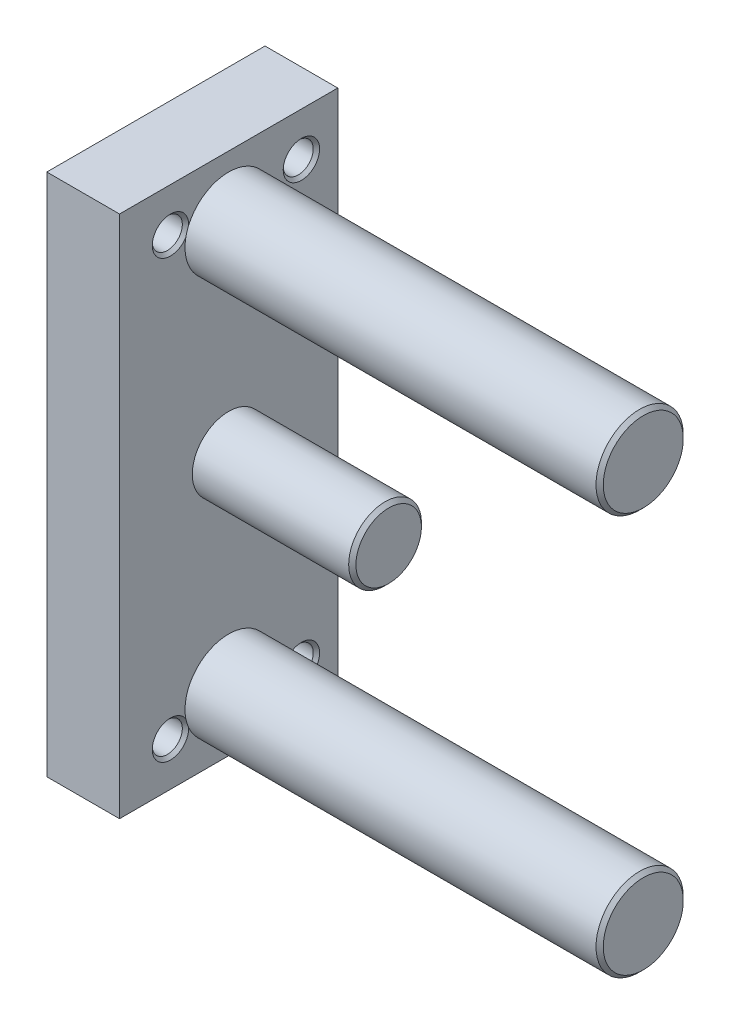
ISO-10303-21;
HEADER;
FILE_DESCRIPTION(('STEP AP214'),'2;1');
FILE_NAME('part.step','',(''),(''),'','','');
FILE_SCHEMA(('AUTOMOTIVE_DESIGN { 1 0 10303 214 1 1 1 1 }'));
ENDSEC;
DATA;
#1=APPLICATION_CONTEXT('core data for automotive mechanical design processes');
#2=APPLICATION_PROTOCOL_DEFINITION('international standard','automotive_design',2000,#1);
#3=PRODUCT_CONTEXT('',#1,'mechanical');
#4=PRODUCT('Part','Part','',(#3));
#5=PRODUCT_RELATED_PRODUCT_CATEGORY('part','',(#4));
#6=PRODUCT_DEFINITION_FORMATION('','',#4);
#7=PRODUCT_DEFINITION_CONTEXT('part definition',#1,'design');
#8=PRODUCT_DEFINITION('design','',#6,#7);
#9=PRODUCT_DEFINITION_SHAPE('','',#8);
#10=(LENGTH_UNIT() NAMED_UNIT(*) SI_UNIT(.MILLI.,.METRE.));
#11=(NAMED_UNIT(*) PLANE_ANGLE_UNIT() SI_UNIT($,.RADIAN.));
#12=(NAMED_UNIT(*) SI_UNIT($,.STERADIAN.) SOLID_ANGLE_UNIT());
#13=UNCERTAINTY_MEASURE_WITH_UNIT(LENGTH_MEASURE(1.E-05),#10,'distance_accuracy_value','');
#14=(GEOMETRIC_REPRESENTATION_CONTEXT(3) GLOBAL_UNCERTAINTY_ASSIGNED_CONTEXT((#13)) GLOBAL_UNIT_ASSIGNED_CONTEXT((#10,
#11,#12)) REPRESENTATION_CONTEXT('',''));
#15=CARTESIAN_POINT('',(0.,0.,0.));
#16=DIRECTION('',(0.,0.,1.));
#17=DIRECTION('',(1.,0.,0.));
#18=AXIS2_PLACEMENT_3D('',#15,#16,#17);
#19=CARTESIAN_POINT('',(10.,0.,0.));
#20=DIRECTION('',(1.,0.,0.));
#21=DIRECTION('',(0.,0.,-1.));
#22=AXIS2_PLACEMENT_3D('',#19,#20,#21);
#23=PLANE('',#22);
#24=CARTESIAN_POINT('',(10.,-30.,8.));
#25=DIRECTION('',(-1.,0.,0.));
#26=DIRECTION('',(0.,0.,1.));
#27=AXIS2_PLACEMENT_3D('',#24,#25,#26);
#28=CIRCLE('',#27,2.5);
#29=CARTESIAN_POINT('',(10.,-29.8926166328409,5.50230730223721));
#30=VERTEX_POINT('',#29);
#31=CARTESIAN_POINT('',(10.,-28.666102228369,5.88559305363468));
#32=VERTEX_POINT('',#31);
#33=EDGE_CURVE('E58',#30,#32,#28,.T.);
#34=ORIENTED_EDGE('',*,*,#33,.T.);
#35=CARTESIAN_POINT('',(10.,-27.5,0.));
#36=DIRECTION('',(-1.,0.,0.));
#37=DIRECTION('',(0.,0.,1.));
#38=AXIS2_PLACEMENT_3D('',#35,#36,#37);
#39=CIRCLE('',#38,6.);
#40=EDGE_CURVE('E124',#32,#30,#39,.T.);
#41=ORIENTED_EDGE('',*,*,#40,.T.);
#42=EDGE_LOOP('',(#34,#41));
#43=FACE_BOUND('',#42,.T.);
#44=CARTESIAN_POINT('',(10.,-30.,-9.99999999999999));
#45=DIRECTION('',(-1.,0.,0.));
#46=DIRECTION('',(0.,0.,1.));
#47=AXIS2_PLACEMENT_3D('',#44,#45,#46);
#48=CIRCLE('',#47,2.5);
#49=CARTESIAN_POINT('',(10.,-30.,-7.49999999999999));
#50=VERTEX_POINT('',#49);
#51=EDGE_CURVE('E219',#50,#50,#48,.T.);
#52=ORIENTED_EDGE('',*,*,#51,.T.);
#53=EDGE_LOOP('',(#52));
#54=FACE_BOUND('',#53,.T.);
#55=DIRECTION('',(0.,-1.,0.));
#56=VECTOR('',#55,1.);
#57=CARTESIAN_POINT('',(10.,36.,15.));
#58=LINE('',#57,#56);
#59=CARTESIAN_POINT('',(10.,36.,15.));
#60=VERTEX_POINT('',#59);
#61=CARTESIAN_POINT('',(10.,-36.,15.));
#62=VERTEX_POINT('',#61);
#63=EDGE_CURVE('E244',#60,#62,#58,.T.);
#64=ORIENTED_EDGE('',*,*,#63,.T.);
#65=DIRECTION('',(0.,0.,-1.));
#66=VECTOR('',#65,1.);
#67=CARTESIAN_POINT('',(10.,-36.,15.));
#68=LINE('',#67,#66);
#69=CARTESIAN_POINT('',(10.,-36.,-15.));
#70=VERTEX_POINT('',#69);
#71=EDGE_CURVE('E247',#62,#70,#68,.T.);
#72=ORIENTED_EDGE('',*,*,#71,.T.);
#73=DIRECTION('',(0.,1.,0.));
#74=VECTOR('',#73,1.);
#75=CARTESIAN_POINT('',(10.,-36.,-15.));
#76=LINE('',#75,#74);
#77=CARTESIAN_POINT('',(10.,36.,-15.));
#78=VERTEX_POINT('',#77);
#79=EDGE_CURVE('E250',#70,#78,#76,.T.);
#80=ORIENTED_EDGE('',*,*,#79,.T.);
#81=DIRECTION('',(0.,0.,1.));
#82=VECTOR('',#81,1.);
#83=CARTESIAN_POINT('',(10.,36.,-15.));
#84=LINE('',#83,#82);
#85=EDGE_CURVE('E252',#78,#60,#84,.T.);
#86=ORIENTED_EDGE('',*,*,#85,.T.);
#87=EDGE_LOOP('',(#64,#72,#80,#86));
#88=FACE_BOUND('',#87,.T.);
#89=CARTESIAN_POINT('',(10.,30.,-10.));
#90=DIRECTION('',(-1.,0.,0.));
#91=DIRECTION('',(0.,0.,1.));
#92=AXIS2_PLACEMENT_3D('',#89,#90,#91);
#93=CIRCLE('',#92,2.5);
#94=CARTESIAN_POINT('',(10.,30.,-7.5));
#95=VERTEX_POINT('',#94);
#96=EDGE_CURVE('E231',#95,#95,#93,.T.);
#97=ORIENTED_EDGE('',*,*,#96,.T.);
#98=EDGE_LOOP('',(#97));
#99=FACE_BOUND('',#98,.T.);
#100=CARTESIAN_POINT('',(10.,0.,0.));
#101=DIRECTION('',(-1.,0.,0.));
#102=DIRECTION('',(0.,0.,1.));
#103=AXIS2_PLACEMENT_3D('',#100,#101,#102);
#104=CIRCLE('',#103,5.);
#105=CARTESIAN_POINT('',(10.,0.,5.));
#106=VERTEX_POINT('',#105);
#107=EDGE_CURVE('E134',#106,#106,#104,.T.);
#108=ORIENTED_EDGE('',*,*,#107,.T.);
#109=EDGE_LOOP('',(#108));
#110=FACE_BOUND('',#109,.T.);
#111=CARTESIAN_POINT('',(10.,30.,7.99999999999999));
#112=DIRECTION('',(-1.,0.,0.));
#113=DIRECTION('',(0.,0.,1.));
#114=AXIS2_PLACEMENT_3D('',#111,#112,#113);
#115=CIRCLE('',#114,2.5);
#116=CARTESIAN_POINT('',(10.,28.6661022283692,5.88559305363465));
#117=VERTEX_POINT('',#116);
#118=CARTESIAN_POINT('',(10.,29.892616632841,5.5023073022372));
#119=VERTEX_POINT('',#118);
#120=EDGE_CURVE('E51',#117,#119,#115,.T.);
#121=ORIENTED_EDGE('',*,*,#120,.T.);
#122=CARTESIAN_POINT('',(10.,27.5,0.));
#123=DIRECTION('',(-1.,0.,0.));
#124=DIRECTION('',(0.,0.,1.));
#125=AXIS2_PLACEMENT_3D('',#122,#123,#124);
#126=CIRCLE('',#125,6.);
#127=EDGE_CURVE('E103',#119,#117,#126,.T.);
#128=ORIENTED_EDGE('',*,*,#127,.T.);
#129=EDGE_LOOP('',(#121,#128));
#130=FACE_BOUND('',#129,.T.);
#131=ADVANCED_FACE('F37',(#43,#54,#88,#99,#110,#130),#23,.T.);
#132=CARTESIAN_POINT('',(0.,0.,0.));
#133=DIRECTION('',(1.,0.,0.));
#134=DIRECTION('',(0.,0.,-1.));
#135=AXIS2_PLACEMENT_3D('',#132,#133,#134);
#136=PLANE('',#135);
#137=CARTESIAN_POINT('',(0.,0.,0.));
#138=DIRECTION('',(-1.,0.,0.));
#139=DIRECTION('',(0.,0.,1.));
#140=AXIS2_PLACEMENT_3D('',#137,#138,#139);
#141=CIRCLE('',#140,3.8);
#142=CARTESIAN_POINT('',(0.,0.,3.8));
#143=VERTEX_POINT('',#142);
#144=EDGE_CURVE('E176',#143,#143,#141,.T.);
#145=ORIENTED_EDGE('',*,*,#144,.F.);
#146=EDGE_LOOP('',(#145));
#147=FACE_BOUND('',#146,.T.);
#148=CARTESIAN_POINT('',(0.,-30.,8.));
#149=DIRECTION('',(-1.,0.,0.));
#150=DIRECTION('',(0.,0.,1.));
#151=AXIS2_PLACEMENT_3D('',#148,#149,#150);
#152=CIRCLE('',#151,2.5);
#153=CARTESIAN_POINT('',(0.,-30.,10.5));
#154=VERTEX_POINT('',#153);
#155=EDGE_CURVE('E101',#154,#154,#152,.T.);
#156=ORIENTED_EDGE('',*,*,#155,.F.);
#157=EDGE_LOOP('',(#156));
#158=FACE_BOUND('',#157,.T.);
#159=CARTESIAN_POINT('',(0.,-30.,-9.99999999999999));
#160=DIRECTION('',(-1.,0.,0.));
#161=DIRECTION('',(0.,0.,1.));
#162=AXIS2_PLACEMENT_3D('',#159,#160,#161);
#163=CIRCLE('',#162,2.5);
#164=CARTESIAN_POINT('',(0.,-30.,-7.49999999999999));
#165=VERTEX_POINT('',#164);
#166=EDGE_CURVE('E228',#165,#165,#163,.T.);
#167=ORIENTED_EDGE('',*,*,#166,.F.);
#168=EDGE_LOOP('',(#167));
#169=FACE_BOUND('',#168,.T.);
#170=DIRECTION('',(0.,-1.,0.));
#171=VECTOR('',#170,1.);
#172=CARTESIAN_POINT('',(0.,36.,15.));
#173=LINE('',#172,#171);
#174=CARTESIAN_POINT('',(0.,36.,15.));
#175=VERTEX_POINT('',#174);
#176=CARTESIAN_POINT('',(0.,-36.,15.));
#177=VERTEX_POINT('',#176);
#178=EDGE_CURVE('E243',#175,#177,#173,.T.);
#179=ORIENTED_EDGE('',*,*,#178,.F.);
#180=DIRECTION('',(0.,0.,1.));
#181=VECTOR('',#180,1.);
#182=CARTESIAN_POINT('',(0.,36.,-15.));
#183=LINE('',#182,#181);
#184=CARTESIAN_POINT('',(0.,36.,-15.));
#185=VERTEX_POINT('',#184);
#186=EDGE_CURVE('E248',#185,#175,#183,.T.);
#187=ORIENTED_EDGE('',*,*,#186,.F.);
#188=DIRECTION('',(0.,1.,0.));
#189=VECTOR('',#188,1.);
#190=CARTESIAN_POINT('',(0.,-36.,-15.));
#191=LINE('',#190,#189);
#192=CARTESIAN_POINT('',(0.,-36.,-15.));
#193=VERTEX_POINT('',#192);
#194=EDGE_CURVE('E259',#193,#185,#191,.T.);
#195=ORIENTED_EDGE('',*,*,#194,.F.);
#196=DIRECTION('',(0.,0.,-1.));
#197=VECTOR('',#196,1.);
#198=CARTESIAN_POINT('',(0.,-36.,15.));
#199=LINE('',#198,#197);
#200=EDGE_CURVE('E257',#177,#193,#199,.T.);
#201=ORIENTED_EDGE('',*,*,#200,.F.);
#202=EDGE_LOOP('',(#179,#187,#195,#201));
#203=FACE_BOUND('',#202,.T.);
#204=CARTESIAN_POINT('',(0.,30.,-10.));
#205=DIRECTION('',(-1.,0.,0.));
#206=DIRECTION('',(0.,0.,1.));
#207=AXIS2_PLACEMENT_3D('',#204,#205,#206);
#208=CIRCLE('',#207,2.5);
#209=CARTESIAN_POINT('',(0.,30.,-7.5));
#210=VERTEX_POINT('',#209);
#211=EDGE_CURVE('E240',#210,#210,#208,.T.);
#212=ORIENTED_EDGE('',*,*,#211,.F.);
#213=EDGE_LOOP('',(#212));
#214=FACE_BOUND('',#213,.T.);
#215=CARTESIAN_POINT('',(0.,30.,7.99999999999999));
#216=DIRECTION('',(-1.,0.,0.));
#217=DIRECTION('',(0.,0.,1.));
#218=AXIS2_PLACEMENT_3D('',#215,#216,#217);
#219=CIRCLE('',#218,2.5);
#220=CARTESIAN_POINT('',(0.,30.,10.5));
#221=VERTEX_POINT('',#220);
#222=EDGE_CURVE('E216',#221,#221,#219,.T.);
#223=ORIENTED_EDGE('',*,*,#222,.F.);
#224=EDGE_LOOP('',(#223));
#225=FACE_BOUND('',#224,.T.);
#226=CARTESIAN_POINT('',(0.,27.5,0.));
#227=DIRECTION('',(-1.,0.,0.));
#228=DIRECTION('',(0.,0.,1.));
#229=AXIS2_PLACEMENT_3D('',#226,#227,#228);
#230=CIRCLE('',#229,3.8);
#231=CARTESIAN_POINT('',(0.,27.5,3.8));
#232=VERTEX_POINT('',#231);
#233=EDGE_CURVE('E197',#232,#232,#230,.T.);
#234=ORIENTED_EDGE('',*,*,#233,.F.);
#235=EDGE_LOOP('',(#234));
#236=FACE_BOUND('',#235,.T.);
#237=CARTESIAN_POINT('',(0.,-27.5,0.));
#238=DIRECTION('',(-1.,0.,0.));
#239=DIRECTION('',(0.,0.,1.));
#240=AXIS2_PLACEMENT_3D('',#237,#238,#239);
#241=CIRCLE('',#240,3.8);
#242=CARTESIAN_POINT('',(0.,-27.5,3.8));
#243=VERTEX_POINT('',#242);
#244=EDGE_CURVE('E155',#243,#243,#241,.T.);
#245=ORIENTED_EDGE('',*,*,#244,.F.);
#246=EDGE_LOOP('',(#245));
#247=FACE_BOUND('',#246,.T.);
#248=ADVANCED_FACE('F277',(#147,#158,#169,#203,#214,#225,#236,#247),#136,.F.);
#249=CARTESIAN_POINT('',(10.,36.,15.));
#250=DIRECTION('',(0.,0.,-1.));
#251=DIRECTION('',(-1.,0.,0.));
#252=AXIS2_PLACEMENT_3D('',#249,#250,#251);
#253=PLANE('',#252);
#254=ORIENTED_EDGE('',*,*,#178,.T.);
#255=DIRECTION('',(-1.,0.,0.));
#256=VECTOR('',#255,1.);
#257=CARTESIAN_POINT('',(10.,-36.,15.));
#258=LINE('',#257,#256);
#259=EDGE_CURVE('E11',#62,#177,#258,.T.);
#260=ORIENTED_EDGE('',*,*,#259,.F.);
#261=ORIENTED_EDGE('',*,*,#63,.F.);
#262=DIRECTION('',(-1.,0.,0.));
#263=VECTOR('',#262,1.);
#264=CARTESIAN_POINT('',(10.,36.,15.));
#265=LINE('',#264,#263);
#266=EDGE_CURVE('E254',#60,#175,#265,.T.);
#267=ORIENTED_EDGE('',*,*,#266,.T.);
#268=EDGE_LOOP('',(#254,#260,#261,#267));
#269=FACE_BOUND('',#268,.T.);
#270=ADVANCED_FACE('F39',(#269),#253,.F.);
#271=CARTESIAN_POINT('',(10.,-36.,15.));
#272=DIRECTION('',(0.,1.,0.));
#273=DIRECTION('',(0.,0.,1.));
#274=AXIS2_PLACEMENT_3D('',#271,#272,#273);
#275=PLANE('',#274);
#276=ORIENTED_EDGE('',*,*,#200,.T.);
#277=DIRECTION('',(-1.,0.,0.));
#278=VECTOR('',#277,1.);
#279=CARTESIAN_POINT('',(10.,-36.,-15.));
#280=LINE('',#279,#278);
#281=EDGE_CURVE('E45',#70,#193,#280,.T.);
#282=ORIENTED_EDGE('',*,*,#281,.F.);
#283=ORIENTED_EDGE('',*,*,#71,.F.);
#284=ORIENTED_EDGE('',*,*,#259,.T.);
#285=EDGE_LOOP('',(#276,#282,#283,#284));
#286=FACE_BOUND('',#285,.T.);
#287=ADVANCED_FACE('F288',(#286),#275,.F.);
#288=CARTESIAN_POINT('',(10.,-36.,-15.));
#289=DIRECTION('',(0.,0.,1.));
#290=DIRECTION('',(1.,0.,0.));
#291=AXIS2_PLACEMENT_3D('',#288,#289,#290);
#292=PLANE('',#291);
#293=ORIENTED_EDGE('',*,*,#194,.T.);
#294=DIRECTION('',(-1.,0.,0.));
#295=VECTOR('',#294,1.);
#296=CARTESIAN_POINT('',(10.,36.,-15.));
#297=LINE('',#296,#295);
#298=EDGE_CURVE('E264',#78,#185,#297,.T.);
#299=ORIENTED_EDGE('',*,*,#298,.F.);
#300=ORIENTED_EDGE('',*,*,#79,.F.);
#301=ORIENTED_EDGE('',*,*,#281,.T.);
#302=EDGE_LOOP('',(#293,#299,#300,#301));
#303=FACE_BOUND('',#302,.T.);
#304=ADVANCED_FACE('F271',(#303),#292,.F.);
#305=CARTESIAN_POINT('',(10.,36.,-15.));
#306=DIRECTION('',(0.,-1.,0.));
#307=DIRECTION('',(0.,0.,-1.));
#308=AXIS2_PLACEMENT_3D('',#305,#306,#307);
#309=PLANE('',#308);
#310=ORIENTED_EDGE('',*,*,#186,.T.);
#311=ORIENTED_EDGE('',*,*,#266,.F.);
#312=ORIENTED_EDGE('',*,*,#85,.F.);
#313=ORIENTED_EDGE('',*,*,#298,.T.);
#314=EDGE_LOOP('',(#310,#311,#312,#313));
#315=FACE_BOUND('',#314,.T.);
#316=ADVANCED_FACE('F281',(#315),#309,.F.);
#317=CARTESIAN_POINT('',(0.432999999999999,30.,-10.));
#318=DIRECTION('',(-1.,0.,0.));
#319=DIRECTION('',(0.,0.,1.));
#320=AXIS2_PLACEMENT_3D('',#317,#318,#319);
#321=CONICAL_SURFACE('',#320,2.067,0.78539816339745);
#322=ORIENTED_EDGE('',*,*,#211,.T.);
#323=EDGE_LOOP('',(#322));
#324=FACE_BOUND('',#323,.T.);
#325=CARTESIAN_POINT('',(0.432999999999999,30.,-10.));
#326=DIRECTION('',(-1.,0.,0.));
#327=DIRECTION('',(0.,0.,1.));
#328=AXIS2_PLACEMENT_3D('',#325,#326,#327);
#329=CIRCLE('',#328,2.067);
#330=CARTESIAN_POINT('',(0.432999999999999,30.,-7.933));
#331=VERTEX_POINT('',#330);
#332=EDGE_CURVE('E237',#331,#331,#329,.T.);
#333=ORIENTED_EDGE('',*,*,#332,.F.);
#334=EDGE_LOOP('',(#333));
#335=FACE_BOUND('',#334,.T.);
#336=ADVANCED_FACE('F304',(#324,#335),#321,.F.);
#337=CARTESIAN_POINT('',(10.,30.,-10.));
#338=DIRECTION('',(-1.,0.,0.));
#339=DIRECTION('',(0.,0.,1.));
#340=AXIS2_PLACEMENT_3D('',#337,#338,#339);
#341=CYLINDRICAL_SURFACE('',#340,2.067);
#342=ORIENTED_EDGE('',*,*,#332,.T.);
#343=EDGE_LOOP('',(#342));
#344=FACE_BOUND('',#343,.T.);
#345=CARTESIAN_POINT('',(9.567,30.,-10.));
#346=DIRECTION('',(-1.,0.,0.));
#347=DIRECTION('',(0.,0.,1.));
#348=AXIS2_PLACEMENT_3D('',#345,#346,#347);
#349=CIRCLE('',#348,2.067);
#350=CARTESIAN_POINT('',(9.567,30.,-7.933));
#351=VERTEX_POINT('',#350);
#352=EDGE_CURVE('E234',#351,#351,#349,.T.);
#353=ORIENTED_EDGE('',*,*,#352,.F.);
#354=EDGE_LOOP('',(#353));
#355=FACE_BOUND('',#354,.T.);
#356=ADVANCED_FACE('F311',(#344,#355),#341,.F.);
#357=CARTESIAN_POINT('',(10.,30.,-10.));
#358=DIRECTION('',(1.,0.,0.));
#359=DIRECTION('',(0.,0.,-1.));
#360=AXIS2_PLACEMENT_3D('',#357,#358,#359);
#361=CONICAL_SURFACE('',#360,2.5,0.78539816339745);
#362=ORIENTED_EDGE('',*,*,#352,.T.);
#363=EDGE_LOOP('',(#362));
#364=FACE_BOUND('',#363,.T.);
#365=ORIENTED_EDGE('',*,*,#96,.F.);
#366=EDGE_LOOP('',(#365));
#367=FACE_BOUND('',#366,.T.);
#368=ADVANCED_FACE('F316',(#364,#367),#361,.F.);
#369=CARTESIAN_POINT('',(0.432999999999999,-30.,-9.99999999999999));
#370=DIRECTION('',(-1.,0.,0.));
#371=DIRECTION('',(0.,0.,1.));
#372=AXIS2_PLACEMENT_3D('',#369,#370,#371);
#373=CONICAL_SURFACE('',#372,2.067,0.78539816339745);
#374=ORIENTED_EDGE('',*,*,#166,.T.);
#375=EDGE_LOOP('',(#374));
#376=FACE_BOUND('',#375,.T.);
#377=CARTESIAN_POINT('',(0.432999999999999,-30.,-9.99999999999999));
#378=DIRECTION('',(-1.,0.,0.));
#379=DIRECTION('',(0.,0.,1.));
#380=AXIS2_PLACEMENT_3D('',#377,#378,#379);
#381=CIRCLE('',#380,2.067);
#382=CARTESIAN_POINT('',(0.432999999999999,-30.,-7.93299999999999));
#383=VERTEX_POINT('',#382);
#384=EDGE_CURVE('E225',#383,#383,#381,.T.);
#385=ORIENTED_EDGE('',*,*,#384,.F.);
#386=EDGE_LOOP('',(#385));
#387=FACE_BOUND('',#386,.T.);
#388=ADVANCED_FACE('F326',(#376,#387),#373,.F.);
#389=CARTESIAN_POINT('',(10.,-30.,-9.99999999999999));
#390=DIRECTION('',(-1.,0.,0.));
#391=DIRECTION('',(0.,0.,1.));
#392=AXIS2_PLACEMENT_3D('',#389,#390,#391);
#393=CYLINDRICAL_SURFACE('',#392,2.067);
#394=ORIENTED_EDGE('',*,*,#384,.T.);
#395=EDGE_LOOP('',(#394));
#396=FACE_BOUND('',#395,.T.);
#397=CARTESIAN_POINT('',(9.567,-30.,-9.99999999999999));
#398=DIRECTION('',(-1.,0.,0.));
#399=DIRECTION('',(0.,0.,1.));
#400=AXIS2_PLACEMENT_3D('',#397,#398,#399);
#401=CIRCLE('',#400,2.067);
#402=CARTESIAN_POINT('',(9.567,-30.,-7.93299999999999));
#403=VERTEX_POINT('',#402);
#404=EDGE_CURVE('E222',#403,#403,#401,.T.);
#405=ORIENTED_EDGE('',*,*,#404,.F.);
#406=EDGE_LOOP('',(#405));
#407=FACE_BOUND('',#406,.T.);
#408=ADVANCED_FACE('F466',(#396,#407),#393,.F.);
#409=CARTESIAN_POINT('',(10.,-30.,-9.99999999999999));
#410=DIRECTION('',(1.,0.,0.));
#411=DIRECTION('',(0.,0.,-1.));
#412=AXIS2_PLACEMENT_3D('',#409,#410,#411);
#413=CONICAL_SURFACE('',#412,2.5,0.78539816339745);
#414=ORIENTED_EDGE('',*,*,#404,.T.);
#415=EDGE_LOOP('',(#414));
#416=FACE_BOUND('',#415,.T.);
#417=ORIENTED_EDGE('',*,*,#51,.F.);
#418=EDGE_LOOP('',(#417));
#419=FACE_BOUND('',#418,.T.);
#420=ADVANCED_FACE('F462',(#416,#419),#413,.F.);
#421=CARTESIAN_POINT('',(0.432999999999999,30.,7.99999999999999));
#422=DIRECTION('',(-1.,0.,0.));
#423=DIRECTION('',(0.,0.,1.));
#424=AXIS2_PLACEMENT_3D('',#421,#422,#423);
#425=CONICAL_SURFACE('',#424,2.067,0.78539816339745);
#426=ORIENTED_EDGE('',*,*,#222,.T.);
#427=EDGE_LOOP('',(#426));
#428=FACE_BOUND('',#427,.T.);
#429=CARTESIAN_POINT('',(0.432999999999999,30.,7.99999999999999));
#430=DIRECTION('',(-1.,0.,0.));
#431=DIRECTION('',(0.,0.,1.));
#432=AXIS2_PLACEMENT_3D('',#429,#430,#431);
#433=CIRCLE('',#432,2.067);
#434=CARTESIAN_POINT('',(0.432999999999999,30.,10.067));
#435=VERTEX_POINT('',#434);
#436=EDGE_CURVE('E213',#435,#435,#433,.T.);
#437=ORIENTED_EDGE('',*,*,#436,.F.);
#438=EDGE_LOOP('',(#437));
#439=FACE_BOUND('',#438,.T.);
#440=ADVANCED_FACE('F458',(#428,#439),#425,.F.);
#441=CARTESIAN_POINT('',(10.,30.,7.99999999999999));
#442=DIRECTION('',(-1.,0.,0.));
#443=DIRECTION('',(0.,0.,1.));
#444=AXIS2_PLACEMENT_3D('',#441,#442,#443);
#445=CYLINDRICAL_SURFACE('',#444,2.067);
#446=ORIENTED_EDGE('',*,*,#436,.T.);
#447=EDGE_LOOP('',(#446));
#448=FACE_BOUND('',#447,.T.);
#449=CARTESIAN_POINT('',(9.567,30.,7.99999999999999));
#450=DIRECTION('',(-1.,0.,0.));
#451=DIRECTION('',(0.,0.,1.));
#452=AXIS2_PLACEMENT_3D('',#449,#450,#451);
#453=CIRCLE('',#452,2.067);
#454=CARTESIAN_POINT('',(9.567,30.,10.067));
#455=VERTEX_POINT('',#454);
#456=EDGE_CURVE('E112',#455,#455,#453,.T.);
#457=ORIENTED_EDGE('',*,*,#456,.F.);
#458=EDGE_LOOP('',(#457));
#459=FACE_BOUND('',#458,.T.);
#460=ADVANCED_FACE('F454',(#448,#459),#445,.F.);
#461=CARTESIAN_POINT('',(10.,30.,7.99999999999999));
#462=DIRECTION('',(1.,0.,0.));
#463=DIRECTION('',(0.,0.,-1.));
#464=AXIS2_PLACEMENT_3D('',#461,#462,#463);
#465=CONICAL_SURFACE('',#464,2.5,0.78539816339745);
#466=ORIENTED_EDGE('',*,*,#456,.T.);
#467=EDGE_LOOP('',(#466));
#468=FACE_BOUND('',#467,.T.);
#469=EDGE_CURVE('E99',#119,#117,#115,.T.);
#470=ORIENTED_EDGE('',*,*,#469,.F.);
#471=ORIENTED_EDGE('',*,*,#120,.F.);
#472=EDGE_LOOP('',(#470,#471));
#473=FACE_BOUND('',#472,.T.);
#474=ADVANCED_FACE('F97',(#468,#473),#465,.F.);
#475=CARTESIAN_POINT('',(0.432999999999999,-30.,8.));
#476=DIRECTION('',(-1.,0.,0.));
#477=DIRECTION('',(0.,0.,1.));
#478=AXIS2_PLACEMENT_3D('',#475,#476,#477);
#479=CONICAL_SURFACE('',#478,2.067,0.78539816339745);
#480=ORIENTED_EDGE('',*,*,#155,.T.);
#481=EDGE_LOOP('',(#480));
#482=FACE_BOUND('',#481,.T.);
#483=CARTESIAN_POINT('',(0.432999999999999,-30.,8.));
#484=DIRECTION('',(-1.,0.,0.));
#485=DIRECTION('',(0.,0.,1.));
#486=AXIS2_PLACEMENT_3D('',#483,#484,#485);
#487=CIRCLE('',#486,2.067);
#488=CARTESIAN_POINT('',(0.432999999999999,-30.,10.067));
#489=VERTEX_POINT('',#488);
#490=EDGE_CURVE('E206',#489,#489,#487,.T.);
#491=ORIENTED_EDGE('',*,*,#490,.F.);
#492=EDGE_LOOP('',(#491));
#493=FACE_BOUND('',#492,.T.);
#494=ADVANCED_FACE('F447',(#482,#493),#479,.F.);
#495=CARTESIAN_POINT('',(10.,-30.,8.));
#496=DIRECTION('',(-1.,0.,0.));
#497=DIRECTION('',(0.,0.,1.));
#498=AXIS2_PLACEMENT_3D('',#495,#496,#497);
#499=CYLINDRICAL_SURFACE('',#498,2.067);
#500=ORIENTED_EDGE('',*,*,#490,.T.);
#501=EDGE_LOOP('',(#500));
#502=FACE_BOUND('',#501,.T.);
#503=CARTESIAN_POINT('',(9.567,-30.,8.));
#504=DIRECTION('',(-1.,0.,0.));
#505=DIRECTION('',(0.,0.,1.));
#506=AXIS2_PLACEMENT_3D('',#503,#504,#505);
#507=CIRCLE('',#506,2.067);
#508=CARTESIAN_POINT('',(9.567,-30.,10.067));
#509=VERTEX_POINT('',#508);
#510=EDGE_CURVE('E203',#509,#509,#507,.T.);
#511=ORIENTED_EDGE('',*,*,#510,.F.);
#512=EDGE_LOOP('',(#511));
#513=FACE_BOUND('',#512,.T.);
#514=ADVANCED_FACE('F443',(#502,#513),#499,.F.);
#515=CARTESIAN_POINT('',(10.,-30.,8.));
#516=DIRECTION('',(1.,0.,0.));
#517=DIRECTION('',(0.,0.,-1.));
#518=AXIS2_PLACEMENT_3D('',#515,#516,#517);
#519=CONICAL_SURFACE('',#518,2.5,0.78539816339745);
#520=ORIENTED_EDGE('',*,*,#510,.T.);
#521=EDGE_LOOP('',(#520));
#522=FACE_BOUND('',#521,.T.);
#523=EDGE_CURVE('E200',#32,#30,#28,.T.);
#524=ORIENTED_EDGE('',*,*,#523,.F.);
#525=ORIENTED_EDGE('',*,*,#33,.F.);
#526=EDGE_LOOP('',(#524,#525));
#527=FACE_BOUND('',#526,.T.);
#528=ADVANCED_FACE('F439',(#522,#527),#519,.F.);
#529=CARTESIAN_POINT('',(5.02158095933999,27.5,0.));
#530=DIRECTION('',(-1.,0.,0.));
#531=DIRECTION('',(0.,0.,1.));
#532=AXIS2_PLACEMENT_3D('',#529,#530,#531);
#533=CYLINDRICAL_SURFACE('',#532,3.8);
#534=ORIENTED_EDGE('',*,*,#233,.T.);
#535=EDGE_LOOP('',(#534));
#536=FACE_BOUND('',#535,.T.);
#537=CARTESIAN_POINT('',(5.55555555555556,27.5,0.));
#538=DIRECTION('',(-1.,0.,0.));
#539=DIRECTION('',(0.,0.,1.));
#540=AXIS2_PLACEMENT_3D('',#537,#538,#539);
#541=CIRCLE('',#540,3.8);
#542=CARTESIAN_POINT('',(5.55555555555556,27.5,3.8));
#543=VERTEX_POINT('',#542);
#544=EDGE_CURVE('E194',#543,#543,#541,.T.);
#545=ORIENTED_EDGE('',*,*,#544,.F.);
#546=EDGE_LOOP('',(#545));
#547=FACE_BOUND('',#546,.T.);
#548=ADVANCED_FACE('F435',(#536,#547),#533,.F.);
#549=CARTESIAN_POINT('',(5.55555555555556,27.5,-3.8));
#550=DIRECTION('',(-1.,0.,0.));
#551=DIRECTION('',(0.,0.,1.));
#552=AXIS2_PLACEMENT_3D('',#549,#550,#551);
#553=PLANE('',#552);
#554=ORIENTED_EDGE('',*,*,#544,.T.);
#555=EDGE_LOOP('',(#554));
#556=FACE_BOUND('',#555,.T.);
#557=CARTESIAN_POINT('',(5.55555555555556,27.5,0.));
#558=DIRECTION('',(-1.,0.,0.));
#559=DIRECTION('',(0.,0.,1.));
#560=AXIS2_PLACEMENT_3D('',#557,#558,#559);
#561=CIRCLE('',#560,3.5);
#562=CARTESIAN_POINT('',(5.55555555555556,27.5,3.5));
#563=VERTEX_POINT('',#562);
#564=EDGE_CURVE('E191',#563,#563,#561,.T.);
#565=ORIENTED_EDGE('',*,*,#564,.F.);
#566=EDGE_LOOP('',(#565));
#567=FACE_BOUND('',#566,.T.);
#568=ADVANCED_FACE('F431',(#556,#567),#553,.T.);
#569=CARTESIAN_POINT('',(5.02158095933999,27.5,0.));
#570=DIRECTION('',(-1.,0.,0.));
#571=DIRECTION('',(0.,0.,1.));
#572=AXIS2_PLACEMENT_3D('',#569,#570,#571);
#573=CYLINDRICAL_SURFACE('',#572,3.5);
#574=ORIENTED_EDGE('',*,*,#564,.T.);
#575=EDGE_LOOP('',(#574));
#576=FACE_BOUND('',#575,.T.);
#577=CARTESIAN_POINT('',(2.05555555555556,27.5,0.));
#578=DIRECTION('',(-1.,0.,0.));
#579=DIRECTION('',(0.,0.,1.));
#580=AXIS2_PLACEMENT_3D('',#577,#578,#579);
#581=CIRCLE('',#580,3.5);
#582=CARTESIAN_POINT('',(2.05555555555556,27.5,3.5));
#583=VERTEX_POINT('',#582);
#584=EDGE_CURVE('E188',#583,#583,#581,.T.);
#585=ORIENTED_EDGE('',*,*,#584,.F.);
#586=EDGE_LOOP('',(#585));
#587=FACE_BOUND('',#586,.T.);
#588=ADVANCED_FACE('F427',(#576,#587),#573,.T.);
#589=CARTESIAN_POINT('',(1.55555555555556,27.5,0.));
#590=DIRECTION('',(1.,0.,0.));
#591=DIRECTION('',(0.,0.,-1.));
#592=AXIS2_PLACEMENT_3D('',#589,#590,#591);
#593=CONICAL_SURFACE('',#592,3.,0.785398163397449);
#594=ORIENTED_EDGE('',*,*,#584,.T.);
#595=EDGE_LOOP('',(#594));
#596=FACE_BOUND('',#595,.T.);
#597=CARTESIAN_POINT('',(1.55555555555556,27.5,0.));
#598=DIRECTION('',(-1.,0.,0.));
#599=DIRECTION('',(0.,0.,1.));
#600=AXIS2_PLACEMENT_3D('',#597,#598,#599);
#601=CIRCLE('',#600,3.);
#602=CARTESIAN_POINT('',(1.55555555555556,27.5,3.));
#603=VERTEX_POINT('',#602);
#604=EDGE_CURVE('E185',#603,#603,#601,.T.);
#605=ORIENTED_EDGE('',*,*,#604,.F.);
#606=EDGE_LOOP('',(#605));
#607=FACE_BOUND('',#606,.T.);
#608=ADVANCED_FACE('F423',(#596,#607),#593,.T.);
#609=CARTESIAN_POINT('',(1.55555555555556,27.5,-3.));
#610=DIRECTION('',(-1.,0.,0.));
#611=DIRECTION('',(0.,0.,1.));
#612=AXIS2_PLACEMENT_3D('',#609,#610,#611);
#613=PLANE('',#612);
#614=ORIENTED_EDGE('',*,*,#604,.T.);
#615=EDGE_LOOP('',(#614));
#616=FACE_BOUND('',#615,.T.);
#617=CARTESIAN_POINT('',(1.55555555555556,27.5,0.));
#618=DIRECTION('',(-1.,0.,0.));
#619=DIRECTION('',(0.,0.,1.));
#620=AXIS2_PLACEMENT_3D('',#617,#618,#619);
#621=CIRCLE('',#620,1.5);
#622=CARTESIAN_POINT('',(1.55555555555556,27.5,1.5));
#623=VERTEX_POINT('',#622);
#624=EDGE_CURVE('E182',#623,#623,#621,.T.);
#625=ORIENTED_EDGE('',*,*,#624,.F.);
#626=EDGE_LOOP('',(#625));
#627=FACE_BOUND('',#626,.T.);
#628=ADVANCED_FACE('F419',(#616,#627),#613,.T.);
#629=CARTESIAN_POINT('',(5.02158095933999,27.5,0.));
#630=DIRECTION('',(-1.,0.,0.));
#631=DIRECTION('',(0.,0.,1.));
#632=AXIS2_PLACEMENT_3D('',#629,#630,#631);
#633=CYLINDRICAL_SURFACE('',#632,1.5);
#634=ORIENTED_EDGE('',*,*,#624,.T.);
#635=EDGE_LOOP('',(#634));
#636=FACE_BOUND('',#635,.T.);
#637=CARTESIAN_POINT('',(4.15555555555556,27.5,0.));
#638=DIRECTION('',(-1.,0.,0.));
#639=DIRECTION('',(0.,0.,1.));
#640=AXIS2_PLACEMENT_3D('',#637,#638,#639);
#641=CIRCLE('',#640,1.5);
#642=CARTESIAN_POINT('',(4.15555555555556,27.5,1.5));
#643=VERTEX_POINT('',#642);
#644=EDGE_CURVE('E179',#643,#643,#641,.T.);
#645=ORIENTED_EDGE('',*,*,#644,.F.);
#646=EDGE_LOOP('',(#645));
#647=FACE_BOUND('',#646,.T.);
#648=ADVANCED_FACE('F415',(#636,#647),#633,.F.);
#649=CARTESIAN_POINT('',(5.02158095933999,27.5,0.));
#650=DIRECTION('',(-1.,0.,0.));
#651=DIRECTION('',(0.,0.,1.));
#652=AXIS2_PLACEMENT_3D('',#649,#650,#651);
#653=CONICAL_SURFACE('',#652,0.,1.0471975511966);
#654=ORIENTED_EDGE('',*,*,#644,.T.);
#655=EDGE_LOOP('',(#654));
#656=FACE_BOUND('',#655,.T.);
#657=CARTESIAN_POINT('',(5.02158095933999,27.5,0.));
#658=VERTEX_POINT('',#657);
#659=VERTEX_LOOP('',#658);
#660=FACE_BOUND('',#659,.T.);
#661=ADVANCED_FACE('F411',(#656,#660),#653,.F.);
#662=CARTESIAN_POINT('',(5.02158095933999,0.,0.));
#663=DIRECTION('',(-1.,0.,0.));
#664=DIRECTION('',(0.,0.,1.));
#665=AXIS2_PLACEMENT_3D('',#662,#663,#664);
#666=CYLINDRICAL_SURFACE('',#665,3.8);
#667=ORIENTED_EDGE('',*,*,#144,.T.);
#668=EDGE_LOOP('',(#667));
#669=FACE_BOUND('',#668,.T.);
#670=CARTESIAN_POINT('',(5.55555555555556,0.,0.));
#671=DIRECTION('',(-1.,0.,0.));
#672=DIRECTION('',(0.,0.,1.));
#673=AXIS2_PLACEMENT_3D('',#670,#671,#672);
#674=CIRCLE('',#673,3.8);
#675=CARTESIAN_POINT('',(5.55555555555556,0.,3.8));
#676=VERTEX_POINT('',#675);
#677=EDGE_CURVE('E173',#676,#676,#674,.T.);
#678=ORIENTED_EDGE('',*,*,#677,.F.);
#679=EDGE_LOOP('',(#678));
#680=FACE_BOUND('',#679,.T.);
#681=ADVANCED_FACE('F407',(#669,#680),#666,.F.);
#682=CARTESIAN_POINT('',(5.55555555555556,0.,-3.8));
#683=DIRECTION('',(-1.,0.,0.));
#684=DIRECTION('',(0.,0.,1.));
#685=AXIS2_PLACEMENT_3D('',#682,#683,#684);
#686=PLANE('',#685);
#687=ORIENTED_EDGE('',*,*,#677,.T.);
#688=EDGE_LOOP('',(#687));
#689=FACE_BOUND('',#688,.T.);
#690=CARTESIAN_POINT('',(5.55555555555556,0.,0.));
#691=DIRECTION('',(-1.,0.,0.));
#692=DIRECTION('',(0.,0.,1.));
#693=AXIS2_PLACEMENT_3D('',#690,#691,#692);
#694=CIRCLE('',#693,3.5);
#695=CARTESIAN_POINT('',(5.55555555555556,0.,3.5));
#696=VERTEX_POINT('',#695);
#697=EDGE_CURVE('E170',#696,#696,#694,.T.);
#698=ORIENTED_EDGE('',*,*,#697,.F.);
#699=EDGE_LOOP('',(#698));
#700=FACE_BOUND('',#699,.T.);
#701=ADVANCED_FACE('F403',(#689,#700),#686,.T.);
#702=CARTESIAN_POINT('',(5.02158095933999,0.,0.));
#703=DIRECTION('',(-1.,0.,0.));
#704=DIRECTION('',(0.,0.,1.));
#705=AXIS2_PLACEMENT_3D('',#702,#703,#704);
#706=CYLINDRICAL_SURFACE('',#705,3.5);
#707=ORIENTED_EDGE('',*,*,#697,.T.);
#708=EDGE_LOOP('',(#707));
#709=FACE_BOUND('',#708,.T.);
#710=CARTESIAN_POINT('',(2.05555555555556,0.,0.));
#711=DIRECTION('',(-1.,0.,0.));
#712=DIRECTION('',(0.,0.,1.));
#713=AXIS2_PLACEMENT_3D('',#710,#711,#712);
#714=CIRCLE('',#713,3.5);
#715=CARTESIAN_POINT('',(2.05555555555556,0.,3.5));
#716=VERTEX_POINT('',#715);
#717=EDGE_CURVE('E167',#716,#716,#714,.T.);
#718=ORIENTED_EDGE('',*,*,#717,.F.);
#719=EDGE_LOOP('',(#718));
#720=FACE_BOUND('',#719,.T.);
#721=ADVANCED_FACE('F399',(#709,#720),#706,.T.);
#722=CARTESIAN_POINT('',(1.55555555555556,0.,0.));
#723=DIRECTION('',(1.,0.,0.));
#724=DIRECTION('',(0.,0.,-1.));
#725=AXIS2_PLACEMENT_3D('',#722,#723,#724);
#726=CONICAL_SURFACE('',#725,3.,0.785398163397449);
#727=ORIENTED_EDGE('',*,*,#717,.T.);
#728=EDGE_LOOP('',(#727));
#729=FACE_BOUND('',#728,.T.);
#730=CARTESIAN_POINT('',(1.55555555555556,0.,0.));
#731=DIRECTION('',(-1.,0.,0.));
#732=DIRECTION('',(0.,0.,1.));
#733=AXIS2_PLACEMENT_3D('',#730,#731,#732);
#734=CIRCLE('',#733,3.);
#735=CARTESIAN_POINT('',(1.55555555555556,0.,3.));
#736=VERTEX_POINT('',#735);
#737=EDGE_CURVE('E164',#736,#736,#734,.T.);
#738=ORIENTED_EDGE('',*,*,#737,.F.);
#739=EDGE_LOOP('',(#738));
#740=FACE_BOUND('',#739,.T.);
#741=ADVANCED_FACE('F395',(#729,#740),#726,.T.);
#742=CARTESIAN_POINT('',(1.55555555555556,0.,-3.));
#743=DIRECTION('',(-1.,0.,0.));
#744=DIRECTION('',(0.,0.,1.));
#745=AXIS2_PLACEMENT_3D('',#742,#743,#744);
#746=PLANE('',#745);
#747=ORIENTED_EDGE('',*,*,#737,.T.);
#748=EDGE_LOOP('',(#747));
#749=FACE_BOUND('',#748,.T.);
#750=CARTESIAN_POINT('',(1.55555555555556,0.,0.));
#751=DIRECTION('',(-1.,0.,0.));
#752=DIRECTION('',(0.,0.,1.));
#753=AXIS2_PLACEMENT_3D('',#750,#751,#752);
#754=CIRCLE('',#753,1.5);
#755=CARTESIAN_POINT('',(1.55555555555556,0.,1.5));
#756=VERTEX_POINT('',#755);
#757=EDGE_CURVE('E161',#756,#756,#754,.T.);
#758=ORIENTED_EDGE('',*,*,#757,.F.);
#759=EDGE_LOOP('',(#758));
#760=FACE_BOUND('',#759,.T.);
#761=ADVANCED_FACE('F391',(#749,#760),#746,.T.);
#762=CARTESIAN_POINT('',(5.02158095933999,0.,0.));
#763=DIRECTION('',(-1.,0.,0.));
#764=DIRECTION('',(0.,0.,1.));
#765=AXIS2_PLACEMENT_3D('',#762,#763,#764);
#766=CYLINDRICAL_SURFACE('',#765,1.5);
#767=ORIENTED_EDGE('',*,*,#757,.T.);
#768=EDGE_LOOP('',(#767));
#769=FACE_BOUND('',#768,.T.);
#770=CARTESIAN_POINT('',(4.15555555555556,0.,0.));
#771=DIRECTION('',(-1.,0.,0.));
#772=DIRECTION('',(0.,0.,1.));
#773=AXIS2_PLACEMENT_3D('',#770,#771,#772);
#774=CIRCLE('',#773,1.5);
#775=CARTESIAN_POINT('',(4.15555555555556,0.,1.5));
#776=VERTEX_POINT('',#775);
#777=EDGE_CURVE('E158',#776,#776,#774,.T.);
#778=ORIENTED_EDGE('',*,*,#777,.F.);
#779=EDGE_LOOP('',(#778));
#780=FACE_BOUND('',#779,.T.);
#781=ADVANCED_FACE('F387',(#769,#780),#766,.F.);
#782=CARTESIAN_POINT('',(5.02158095933999,0.,0.));
#783=DIRECTION('',(-1.,0.,0.));
#784=DIRECTION('',(0.,0.,1.));
#785=AXIS2_PLACEMENT_3D('',#782,#783,#784);
#786=CONICAL_SURFACE('',#785,0.,1.0471975511966);
#787=ORIENTED_EDGE('',*,*,#777,.T.);
#788=EDGE_LOOP('',(#787));
#789=FACE_BOUND('',#788,.T.);
#790=CARTESIAN_POINT('',(5.02158095933999,0.,0.));
#791=VERTEX_POINT('',#790);
#792=VERTEX_LOOP('',#791);
#793=FACE_BOUND('',#792,.T.);
#794=ADVANCED_FACE('F383',(#789,#793),#786,.F.);
#795=CARTESIAN_POINT('',(5.02158095933999,-27.5,0.));
#796=DIRECTION('',(-1.,0.,0.));
#797=DIRECTION('',(0.,0.,1.));
#798=AXIS2_PLACEMENT_3D('',#795,#796,#797);
#799=CYLINDRICAL_SURFACE('',#798,3.8);
#800=ORIENTED_EDGE('',*,*,#244,.T.);
#801=EDGE_LOOP('',(#800));
#802=FACE_BOUND('',#801,.T.);
#803=CARTESIAN_POINT('',(5.55555555555556,-27.5,0.));
#804=DIRECTION('',(-1.,0.,0.));
#805=DIRECTION('',(0.,0.,1.));
#806=AXIS2_PLACEMENT_3D('',#803,#804,#805);
#807=CIRCLE('',#806,3.8);
#808=CARTESIAN_POINT('',(5.55555555555556,-27.5,3.8));
#809=VERTEX_POINT('',#808);
#810=EDGE_CURVE('E152',#809,#809,#807,.T.);
#811=ORIENTED_EDGE('',*,*,#810,.F.);
#812=EDGE_LOOP('',(#811));
#813=FACE_BOUND('',#812,.T.);
#814=ADVANCED_FACE('F379',(#802,#813),#799,.F.);
#815=CARTESIAN_POINT('',(5.55555555555556,-27.5,-3.8));
#816=DIRECTION('',(-1.,0.,0.));
#817=DIRECTION('',(0.,0.,1.));
#818=AXIS2_PLACEMENT_3D('',#815,#816,#817);
#819=PLANE('',#818);
#820=ORIENTED_EDGE('',*,*,#810,.T.);
#821=EDGE_LOOP('',(#820));
#822=FACE_BOUND('',#821,.T.);
#823=CARTESIAN_POINT('',(5.55555555555556,-27.5,0.));
#824=DIRECTION('',(-1.,0.,0.));
#825=DIRECTION('',(0.,0.,1.));
#826=AXIS2_PLACEMENT_3D('',#823,#824,#825);
#827=CIRCLE('',#826,3.5);
#828=CARTESIAN_POINT('',(5.55555555555556,-27.5,3.5));
#829=VERTEX_POINT('',#828);
#830=EDGE_CURVE('E149',#829,#829,#827,.T.);
#831=ORIENTED_EDGE('',*,*,#830,.F.);
#832=EDGE_LOOP('',(#831));
#833=FACE_BOUND('',#832,.T.);
#834=ADVANCED_FACE('F375',(#822,#833),#819,.T.);
#835=CARTESIAN_POINT('',(5.02158095933999,-27.5,0.));
#836=DIRECTION('',(-1.,0.,0.));
#837=DIRECTION('',(0.,0.,1.));
#838=AXIS2_PLACEMENT_3D('',#835,#836,#837);
#839=CYLINDRICAL_SURFACE('',#838,3.5);
#840=ORIENTED_EDGE('',*,*,#830,.T.);
#841=EDGE_LOOP('',(#840));
#842=FACE_BOUND('',#841,.T.);
#843=CARTESIAN_POINT('',(2.05555555555556,-27.5,0.));
#844=DIRECTION('',(-1.,0.,0.));
#845=DIRECTION('',(0.,0.,1.));
#846=AXIS2_PLACEMENT_3D('',#843,#844,#845);
#847=CIRCLE('',#846,3.5);
#848=CARTESIAN_POINT('',(2.05555555555556,-27.5,3.5));
#849=VERTEX_POINT('',#848);
#850=EDGE_CURVE('E146',#849,#849,#847,.T.);
#851=ORIENTED_EDGE('',*,*,#850,.F.);
#852=EDGE_LOOP('',(#851));
#853=FACE_BOUND('',#852,.T.);
#854=ADVANCED_FACE('F371',(#842,#853),#839,.T.);
#855=CARTESIAN_POINT('',(1.55555555555556,-27.5,0.));
#856=DIRECTION('',(1.,0.,0.));
#857=DIRECTION('',(0.,0.,-1.));
#858=AXIS2_PLACEMENT_3D('',#855,#856,#857);
#859=CONICAL_SURFACE('',#858,3.,0.785398163397449);
#860=ORIENTED_EDGE('',*,*,#850,.T.);
#861=EDGE_LOOP('',(#860));
#862=FACE_BOUND('',#861,.T.);
#863=CARTESIAN_POINT('',(1.55555555555556,-27.5,0.));
#864=DIRECTION('',(-1.,0.,0.));
#865=DIRECTION('',(0.,0.,1.));
#866=AXIS2_PLACEMENT_3D('',#863,#864,#865);
#867=CIRCLE('',#866,3.);
#868=CARTESIAN_POINT('',(1.55555555555556,-27.5,3.));
#869=VERTEX_POINT('',#868);
#870=EDGE_CURVE('E143',#869,#869,#867,.T.);
#871=ORIENTED_EDGE('',*,*,#870,.F.);
#872=EDGE_LOOP('',(#871));
#873=FACE_BOUND('',#872,.T.);
#874=ADVANCED_FACE('F367',(#862,#873),#859,.T.);
#875=CARTESIAN_POINT('',(1.55555555555556,-27.5,-3.));
#876=DIRECTION('',(-1.,0.,0.));
#877=DIRECTION('',(0.,0.,1.));
#878=AXIS2_PLACEMENT_3D('',#875,#876,#877);
#879=PLANE('',#878);
#880=ORIENTED_EDGE('',*,*,#870,.T.);
#881=EDGE_LOOP('',(#880));
#882=FACE_BOUND('',#881,.T.);
#883=CARTESIAN_POINT('',(1.55555555555556,-27.5,0.));
#884=DIRECTION('',(-1.,0.,0.));
#885=DIRECTION('',(0.,0.,1.));
#886=AXIS2_PLACEMENT_3D('',#883,#884,#885);
#887=CIRCLE('',#886,1.5);
#888=CARTESIAN_POINT('',(1.55555555555556,-27.5,1.5));
#889=VERTEX_POINT('',#888);
#890=EDGE_CURVE('E140',#889,#889,#887,.T.);
#891=ORIENTED_EDGE('',*,*,#890,.F.);
#892=EDGE_LOOP('',(#891));
#893=FACE_BOUND('',#892,.T.);
#894=ADVANCED_FACE('F363',(#882,#893),#879,.T.);
#895=CARTESIAN_POINT('',(5.02158095933999,-27.5,0.));
#896=DIRECTION('',(-1.,0.,0.));
#897=DIRECTION('',(0.,0.,1.));
#898=AXIS2_PLACEMENT_3D('',#895,#896,#897);
#899=CYLINDRICAL_SURFACE('',#898,1.5);
#900=ORIENTED_EDGE('',*,*,#890,.T.);
#901=EDGE_LOOP('',(#900));
#902=FACE_BOUND('',#901,.T.);
#903=CARTESIAN_POINT('',(4.15555555555556,-27.5,0.));
#904=DIRECTION('',(-1.,0.,0.));
#905=DIRECTION('',(0.,0.,1.));
#906=AXIS2_PLACEMENT_3D('',#903,#904,#905);
#907=CIRCLE('',#906,1.5);
#908=CARTESIAN_POINT('',(4.15555555555556,-27.5,1.5));
#909=VERTEX_POINT('',#908);
#910=EDGE_CURVE('E137',#909,#909,#907,.T.);
#911=ORIENTED_EDGE('',*,*,#910,.F.);
#912=EDGE_LOOP('',(#911));
#913=FACE_BOUND('',#912,.T.);
#914=ADVANCED_FACE('F359',(#902,#913),#899,.F.);
#915=CARTESIAN_POINT('',(5.02158095933999,-27.5,0.));
#916=DIRECTION('',(-1.,0.,0.));
#917=DIRECTION('',(0.,0.,1.));
#918=AXIS2_PLACEMENT_3D('',#915,#916,#917);
#919=CONICAL_SURFACE('',#918,0.,1.0471975511966);
#920=ORIENTED_EDGE('',*,*,#910,.T.);
#921=EDGE_LOOP('',(#920));
#922=FACE_BOUND('',#921,.T.);
#923=CARTESIAN_POINT('',(5.02158095933999,-27.5,0.));
#924=VERTEX_POINT('',#923);
#925=VERTEX_LOOP('',#924);
#926=FACE_BOUND('',#925,.T.);
#927=ADVANCED_FACE('F336',(#922,#926),#919,.F.);
#928=CARTESIAN_POINT('',(32.,0.,0.));
#929=DIRECTION('',(-1.,0.,0.));
#930=DIRECTION('',(0.,0.,1.));
#931=AXIS2_PLACEMENT_3D('',#928,#929,#930);
#932=CYLINDRICAL_SURFACE('',#931,5.);
#933=ORIENTED_EDGE('',*,*,#107,.F.);
#934=EDGE_LOOP('',(#933));
#935=FACE_BOUND('',#934,.T.);
#936=CARTESIAN_POINT('',(31.5,0.,0.));
#937=DIRECTION('',(-1.,0.,0.));
#938=DIRECTION('',(0.,0.,1.));
#939=AXIS2_PLACEMENT_3D('',#936,#937,#938);
#940=CIRCLE('',#939,5.);
#941=CARTESIAN_POINT('',(31.5,0.,5.));
#942=VERTEX_POINT('',#941);
#943=EDGE_CURVE('E131',#942,#942,#940,.T.);
#944=ORIENTED_EDGE('',*,*,#943,.T.);
#945=EDGE_LOOP('',(#944));
#946=FACE_BOUND('',#945,.T.);
#947=ADVANCED_FACE('F332',(#935,#946),#932,.T.);
#948=CARTESIAN_POINT('',(32.,0.,0.));
#949=DIRECTION('',(-1.,0.,0.));
#950=DIRECTION('',(0.,0.,1.));
#951=AXIS2_PLACEMENT_3D('',#948,#949,#950);
#952=CONICAL_SURFACE('',#951,4.5,0.785398163397447);
#953=ORIENTED_EDGE('',*,*,#943,.F.);
#954=EDGE_LOOP('',(#953));
#955=FACE_BOUND('',#954,.T.);
#956=CARTESIAN_POINT('',(32.,0.,0.));
#957=DIRECTION('',(-1.,0.,0.));
#958=DIRECTION('',(0.,0.,1.));
#959=AXIS2_PLACEMENT_3D('',#956,#957,#958);
#960=CIRCLE('',#959,4.5);
#961=CARTESIAN_POINT('',(32.,0.,4.5));
#962=VERTEX_POINT('',#961);
#963=EDGE_CURVE('E128',#962,#962,#960,.T.);
#964=ORIENTED_EDGE('',*,*,#963,.T.);
#965=EDGE_LOOP('',(#964));
#966=FACE_BOUND('',#965,.T.);
#967=ADVANCED_FACE('F335',(#955,#966),#952,.T.);
#968=CARTESIAN_POINT('',(32.,0.,-4.5));
#969=DIRECTION('',(-1.,0.,0.));
#970=DIRECTION('',(0.,0.,1.));
#971=AXIS2_PLACEMENT_3D('',#968,#969,#970);
#972=PLANE('',#971);
#973=ORIENTED_EDGE('',*,*,#963,.F.);
#974=EDGE_LOOP('',(#973));
#975=FACE_BOUND('',#974,.T.);
#976=ADVANCED_FACE('F342',(#975),#972,.F.);
#977=CARTESIAN_POINT('',(10.,-27.5,0.));
#978=DIRECTION('',(1.,0.,0.));
#979=DIRECTION('',(0.,0.,-1.));
#980=AXIS2_PLACEMENT_3D('',#977,#978,#979);
#981=PLANE('',#980);
#982=ORIENTED_EDGE('',*,*,#523,.T.);
#983=EDGE_CURVE('E125',#30,#32,#39,.T.);
#984=ORIENTED_EDGE('',*,*,#983,.T.);
#985=EDGE_LOOP('',(#982,#984));
#986=FACE_BOUND('',#985,.T.);
#987=ADVANCED_FACE('F347',(#986),#981,.F.);
#988=CARTESIAN_POINT('',(67.,-27.5,0.));
#989=DIRECTION('',(-1.,0.,0.));
#990=DIRECTION('',(0.,0.,1.));
#991=AXIS2_PLACEMENT_3D('',#988,#989,#990);
#992=CYLINDRICAL_SURFACE('',#991,6.);
#993=ORIENTED_EDGE('',*,*,#983,.F.);
#994=ORIENTED_EDGE('',*,*,#40,.F.);
#995=EDGE_LOOP('',(#993,#994));
#996=FACE_BOUND('',#995,.T.);
#997=CARTESIAN_POINT('',(66.5,-27.5,0.));
#998=DIRECTION('',(-1.,0.,0.));
#999=DIRECTION('',(0.,0.,1.));
#1000=AXIS2_PLACEMENT_3D('',#997,#998,#999);
#1001=CIRCLE('',#1000,6.);
#1002=CARTESIAN_POINT('',(66.5,-27.5,6.));
#1003=VERTEX_POINT('',#1002);
#1004=EDGE_CURVE('E117',#1003,#1003,#1001,.T.);
#1005=ORIENTED_EDGE('',*,*,#1004,.T.);
#1006=EDGE_LOOP('',(#1005));
#1007=FACE_BOUND('',#1006,.T.);
#1008=ADVANCED_FACE('F352',(#996,#1007),#992,.T.);
#1009=CARTESIAN_POINT('',(67.,-27.5,0.));
#1010=DIRECTION('',(-1.,0.,0.));
#1011=DIRECTION('',(0.,0.,1.));
#1012=AXIS2_PLACEMENT_3D('',#1009,#1010,#1011);
#1013=CONICAL_SURFACE('',#1012,5.5,0.785398163397448);
#1014=ORIENTED_EDGE('',*,*,#1004,.F.);
#1015=EDGE_LOOP('',(#1014));
#1016=FACE_BOUND('',#1015,.T.);
#1017=CARTESIAN_POINT('',(67.,-27.5,0.));
#1018=DIRECTION('',(-1.,0.,0.));
#1019=DIRECTION('',(0.,0.,1.));
#1020=AXIS2_PLACEMENT_3D('',#1017,#1018,#1019);
#1021=CIRCLE('',#1020,5.5);
#1022=CARTESIAN_POINT('',(67.,-27.5,5.5));
#1023=VERTEX_POINT('',#1022);
#1024=EDGE_CURVE('E115',#1023,#1023,#1021,.T.);
#1025=ORIENTED_EDGE('',*,*,#1024,.T.);
#1026=EDGE_LOOP('',(#1025));
#1027=FACE_BOUND('',#1026,.T.);
#1028=ADVANCED_FACE('F634',(#1016,#1027),#1013,.T.);
#1029=CARTESIAN_POINT('',(67.,-27.5,-5.5));
#1030=DIRECTION('',(-1.,0.,0.));
#1031=DIRECTION('',(0.,0.,1.));
#1032=AXIS2_PLACEMENT_3D('',#1029,#1030,#1031);
#1033=PLANE('',#1032);
#1034=ORIENTED_EDGE('',*,*,#1024,.F.);
#1035=EDGE_LOOP('',(#1034));
#1036=FACE_BOUND('',#1035,.T.);
#1037=ADVANCED_FACE('F642',(#1036),#1033,.F.);
#1038=CARTESIAN_POINT('',(10.,27.5,0.));
#1039=DIRECTION('',(1.,0.,0.));
#1040=DIRECTION('',(0.,0.,-1.));
#1041=AXIS2_PLACEMENT_3D('',#1038,#1039,#1040);
#1042=PLANE('',#1041);
#1043=ORIENTED_EDGE('',*,*,#469,.T.);
#1044=EDGE_CURVE('E107',#117,#119,#126,.T.);
#1045=ORIENTED_EDGE('',*,*,#1044,.T.);
#1046=EDGE_LOOP('',(#1043,#1045));
#1047=FACE_BOUND('',#1046,.T.);
#1048=ADVANCED_FACE('F111',(#1047),#1042,.F.);
#1049=CARTESIAN_POINT('',(67.,27.5,0.));
#1050=DIRECTION('',(-1.,0.,0.));
#1051=DIRECTION('',(0.,0.,1.));
#1052=AXIS2_PLACEMENT_3D('',#1049,#1050,#1051);
#1053=CYLINDRICAL_SURFACE('',#1052,6.);
#1054=ORIENTED_EDGE('',*,*,#1044,.F.);
#1055=ORIENTED_EDGE('',*,*,#127,.F.);
#1056=EDGE_LOOP('',(#1054,#1055));
#1057=FACE_BOUND('',#1056,.T.);
#1058=CARTESIAN_POINT('',(66.5,27.5,0.));
#1059=DIRECTION('',(-1.,0.,0.));
#1060=DIRECTION('',(0.,0.,1.));
#1061=AXIS2_PLACEMENT_3D('',#1058,#1059,#1060);
#1062=CIRCLE('',#1061,6.);
#1063=CARTESIAN_POINT('',(66.5,27.5,6.));
#1064=VERTEX_POINT('',#1063);
#1065=EDGE_CURVE('E108',#1064,#1064,#1062,.T.);
#1066=ORIENTED_EDGE('',*,*,#1065,.T.);
#1067=EDGE_LOOP('',(#1066));
#1068=FACE_BOUND('',#1067,.T.);
#1069=ADVANCED_FACE('F113',(#1057,#1068),#1053,.T.);
#1070=CARTESIAN_POINT('',(67.,27.5,0.));
#1071=DIRECTION('',(-1.,0.,0.));
#1072=DIRECTION('',(0.,0.,1.));
#1073=AXIS2_PLACEMENT_3D('',#1070,#1071,#1072);
#1074=CONICAL_SURFACE('',#1073,5.5,0.785398163397448);
#1075=ORIENTED_EDGE('',*,*,#1065,.F.);
#1076=EDGE_LOOP('',(#1075));
#1077=FACE_BOUND('',#1076,.T.);
#1078=CARTESIAN_POINT('',(67.,27.5,0.));
#1079=DIRECTION('',(-1.,0.,0.));
#1080=DIRECTION('',(0.,0.,1.));
#1081=AXIS2_PLACEMENT_3D('',#1078,#1079,#1080);
#1082=CIRCLE('',#1081,5.5);
#1083=CARTESIAN_POINT('',(67.,27.5,5.5));
#1084=VERTEX_POINT('',#1083);
#1085=EDGE_CURVE('E698',#1084,#1084,#1082,.T.);
#1086=ORIENTED_EDGE('',*,*,#1085,.T.);
#1087=EDGE_LOOP('',(#1086));
#1088=FACE_BOUND('',#1087,.T.);
#1089=ADVANCED_FACE('F669',(#1077,#1088),#1074,.T.);
#1090=CARTESIAN_POINT('',(67.,27.5,-5.5));
#1091=DIRECTION('',(-1.,0.,0.));
#1092=DIRECTION('',(0.,0.,1.));
#1093=AXIS2_PLACEMENT_3D('',#1090,#1091,#1092);
#1094=PLANE('',#1093);
#1095=ORIENTED_EDGE('',*,*,#1085,.F.);
#1096=EDGE_LOOP('',(#1095));
#1097=FACE_BOUND('',#1096,.T.);
#1098=ADVANCED_FACE('F677',(#1097),#1094,.F.);
#1099=CLOSED_SHELL('',(#131,#248,#270,#287,#304,#316,#336,#356,#368,#388,#408,#420,#440,#460,
#474,#494,#514,#528,#548,#568,#588,#608,#628,#648,#661,#681,#701,#721,#741,#761,#781,#794,#814,
#834,#854,#874,#894,#914,#927,#947,#967,#976,#987,#1008,#1028,#1037,#1048,#1069,#1089,#1098));
#1100=MANIFOLD_SOLID_BREP('B2',#1099);
#1101=ADVANCED_BREP_SHAPE_REPRESENTATION('',(#18,#1100),#14);
#1102=SHAPE_DEFINITION_REPRESENTATION(#9,#1101);
ENDSEC;
END-ISO-10303-21;
